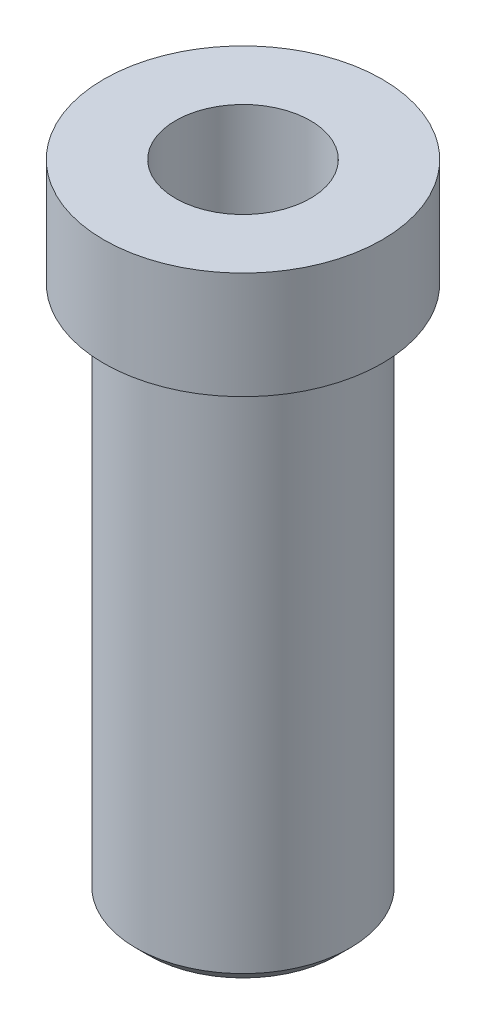
ISO-10303-21;
HEADER;
FILE_DESCRIPTION(('STEP AP214'),'2;1');
FILE_NAME('part.step','',(''),(''),'','','');
FILE_SCHEMA(('AUTOMOTIVE_DESIGN { 1 0 10303 214 1 1 1 1 }'));
ENDSEC;
DATA;
#1=APPLICATION_CONTEXT('core data for automotive mechanical design processes');
#2=APPLICATION_PROTOCOL_DEFINITION('international standard','automotive_design',2000,#1);
#3=PRODUCT_CONTEXT('',#1,'mechanical');
#4=PRODUCT('Part','Part','',(#3));
#5=PRODUCT_RELATED_PRODUCT_CATEGORY('part','',(#4));
#6=PRODUCT_DEFINITION_FORMATION('','',#4);
#7=PRODUCT_DEFINITION_CONTEXT('part definition',#1,'design');
#8=PRODUCT_DEFINITION('design','',#6,#7);
#9=PRODUCT_DEFINITION_SHAPE('','',#8);
#10=(LENGTH_UNIT() NAMED_UNIT(*) SI_UNIT(.MILLI.,.METRE.));
#11=(NAMED_UNIT(*) PLANE_ANGLE_UNIT() SI_UNIT($,.RADIAN.));
#12=(NAMED_UNIT(*) SI_UNIT($,.STERADIAN.) SOLID_ANGLE_UNIT());
#13=UNCERTAINTY_MEASURE_WITH_UNIT(LENGTH_MEASURE(1.E-05),#10,'distance_accuracy_value','');
#14=(GEOMETRIC_REPRESENTATION_CONTEXT(3) GLOBAL_UNCERTAINTY_ASSIGNED_CONTEXT((#13)) GLOBAL_UNIT_ASSIGNED_CONTEXT((#10,
#11,#12)) REPRESENTATION_CONTEXT('',''));
#15=CARTESIAN_POINT('',(0.,0.,0.));
#16=DIRECTION('',(0.,0.,1.));
#17=DIRECTION('',(1.,0.,0.));
#18=AXIS2_PLACEMENT_3D('',#15,#16,#17);
#19=CARTESIAN_POINT('',(0.5,0.,0.));
#20=DIRECTION('',(0.,-1.,0.));
#21=DIRECTION('',(0.,0.,-1.));
#22=AXIS2_PLACEMENT_3D('',#19,#20,#21);
#23=PLANE('',#22);
#24=CARTESIAN_POINT('',(0.,0.,0.));
#25=DIRECTION('',(0.,-1.,0.));
#26=DIRECTION('',(0.,0.,-1.));
#27=AXIS2_PLACEMENT_3D('',#24,#25,#26);
#28=CIRCLE('',#27,0.44);
#29=CARTESIAN_POINT('',(0.,0.,-0.44));
#30=VERTEX_POINT('',#29);
#31=EDGE_CURVE('E43',#30,#30,#28,.T.);
#32=ORIENTED_EDGE('',*,*,#31,.T.);
#33=EDGE_LOOP('',(#32));
#34=FACE_BOUND('',#33,.T.);
#35=CARTESIAN_POINT('',(0.,0.,0.));
#36=DIRECTION('',(0.,1.,0.));
#37=DIRECTION('',(0.,0.,1.));
#38=AXIS2_PLACEMENT_3D('',#35,#36,#37);
#39=CIRCLE('',#38,0.315);
#40=CARTESIAN_POINT('',(0.,0.,0.315));
#41=VERTEX_POINT('',#40);
#42=EDGE_CURVE('E59',#41,#41,#39,.T.);
#43=ORIENTED_EDGE('',*,*,#42,.T.);
#44=EDGE_LOOP('',(#43));
#45=FACE_BOUND('',#44,.T.);
#46=ADVANCED_FACE('F35',(#34,#45),#23,.T.);
#47=CARTESIAN_POINT('',(0.,3.,0.));
#48=DIRECTION('',(0.,1.,0.));
#49=DIRECTION('',(0.,0.,1.));
#50=AXIS2_PLACEMENT_3D('',#47,#48,#49);
#51=PLANE('',#50);
#52=CARTESIAN_POINT('',(0.,3.,0.));
#53=DIRECTION('',(0.,1.,0.));
#54=DIRECTION('',(0.,0.,1.));
#55=AXIS2_PLACEMENT_3D('',#52,#53,#54);
#56=CIRCLE('',#55,0.315);
#57=CARTESIAN_POINT('',(0.,3.,0.315));
#58=VERTEX_POINT('',#57);
#59=EDGE_CURVE('E60',#58,#58,#56,.T.);
#60=ORIENTED_EDGE('',*,*,#59,.F.);
#61=EDGE_LOOP('',(#60));
#62=FACE_BOUND('',#61,.T.);
#63=CARTESIAN_POINT('',(0.,3.,0.));
#64=DIRECTION('',(0.,-1.,0.));
#65=DIRECTION('',(0.,0.,-1.));
#66=AXIS2_PLACEMENT_3D('',#63,#64,#65);
#67=CIRCLE('',#66,0.65);
#68=CARTESIAN_POINT('',(0.,3.,-0.65));
#69=VERTEX_POINT('',#68);
#70=EDGE_CURVE('E47',#69,#69,#67,.T.);
#71=ORIENTED_EDGE('',*,*,#70,.F.);
#72=EDGE_LOOP('',(#71));
#73=FACE_BOUND('',#72,.T.);
#74=ADVANCED_FACE('F74',(#62,#73),#51,.T.);
#75=CARTESIAN_POINT('',(0.,0.,0.));
#76=DIRECTION('',(0.,-1.,0.));
#77=DIRECTION('',(0.,0.,-1.));
#78=AXIS2_PLACEMENT_3D('',#75,#76,#77);
#79=CYLINDRICAL_SURFACE('',#78,0.65);
#80=ORIENTED_EDGE('',*,*,#70,.T.);
#81=EDGE_LOOP('',(#80));
#82=FACE_BOUND('',#81,.T.);
#83=CARTESIAN_POINT('',(0.,2.5,0.));
#84=DIRECTION('',(0.,-1.,0.));
#85=DIRECTION('',(0.,0.,-1.));
#86=AXIS2_PLACEMENT_3D('',#83,#84,#85);
#87=CIRCLE('',#86,0.65);
#88=CARTESIAN_POINT('',(0.,2.5,-0.65));
#89=VERTEX_POINT('',#88);
#90=EDGE_CURVE('E51',#89,#89,#87,.T.);
#91=ORIENTED_EDGE('',*,*,#90,.F.);
#92=EDGE_LOOP('',(#91));
#93=FACE_BOUND('',#92,.T.);
#94=ADVANCED_FACE('F77',(#82,#93),#79,.T.);
#95=CARTESIAN_POINT('',(0.65,2.5,0.));
#96=DIRECTION('',(0.,-1.,0.));
#97=DIRECTION('',(0.,0.,-1.));
#98=AXIS2_PLACEMENT_3D('',#95,#96,#97);
#99=PLANE('',#98);
#100=ORIENTED_EDGE('',*,*,#90,.T.);
#101=EDGE_LOOP('',(#100));
#102=FACE_BOUND('',#101,.T.);
#103=CARTESIAN_POINT('',(0.,2.5,0.));
#104=DIRECTION('',(0.,-1.,0.));
#105=DIRECTION('',(0.,0.,-1.));
#106=AXIS2_PLACEMENT_3D('',#103,#104,#105);
#107=CIRCLE('',#106,0.5);
#108=CARTESIAN_POINT('',(0.,2.5,-0.5));
#109=VERTEX_POINT('',#108);
#110=EDGE_CURVE('E56',#109,#109,#107,.T.);
#111=ORIENTED_EDGE('',*,*,#110,.F.);
#112=EDGE_LOOP('',(#111));
#113=FACE_BOUND('',#112,.T.);
#114=ADVANCED_FACE('F83',(#102,#113),#99,.T.);
#115=CARTESIAN_POINT('',(0.,0.,0.));
#116=DIRECTION('',(0.,-1.,0.));
#117=DIRECTION('',(0.,0.,-1.));
#118=AXIS2_PLACEMENT_3D('',#115,#116,#117);
#119=CYLINDRICAL_SURFACE('',#118,0.5);
#120=CARTESIAN_POINT('',(0.,0.0599999999999996,0.));
#121=DIRECTION('',(0.,-1.,0.));
#122=DIRECTION('',(0.,0.,-1.));
#123=AXIS2_PLACEMENT_3D('',#120,#121,#122);
#124=CIRCLE('',#123,0.5);
#125=CARTESIAN_POINT('',(0.,0.0599999999999996,-0.5));
#126=VERTEX_POINT('',#125);
#127=EDGE_CURVE('E10',#126,#126,#124,.F.);
#128=ORIENTED_EDGE('',*,*,#127,.T.);
#129=EDGE_LOOP('',(#128));
#130=FACE_BOUND('',#129,.T.);
#131=ORIENTED_EDGE('',*,*,#110,.T.);
#132=EDGE_LOOP('',(#131));
#133=FACE_BOUND('',#132,.T.);
#134=ADVANCED_FACE('F70',(#130,#133),#119,.T.);
#135=CARTESIAN_POINT('',(0.,0.,0.));
#136=DIRECTION('',(0.,1.,0.));
#137=DIRECTION('',(0.,0.,1.));
#138=AXIS2_PLACEMENT_3D('',#135,#136,#137);
#139=CYLINDRICAL_SURFACE('',#138,0.315);
#140=ORIENTED_EDGE('',*,*,#42,.F.);
#141=EDGE_LOOP('',(#140));
#142=FACE_BOUND('',#141,.T.);
#143=ORIENTED_EDGE('',*,*,#59,.T.);
#144=EDGE_LOOP('',(#143));
#145=FACE_BOUND('',#144,.T.);
#146=ADVANCED_FACE('F67',(#142,#145),#139,.F.);
#147=CARTESIAN_POINT('',(0.,0.,0.));
#148=DIRECTION('',(0.,1.,0.));
#149=DIRECTION('',(0.,0.,1.));
#150=AXIS2_PLACEMENT_3D('',#147,#148,#149);
#151=CONICAL_SURFACE('',#150,0.44,0.785398163397447);
#152=ORIENTED_EDGE('',*,*,#127,.F.);
#153=EDGE_LOOP('',(#152));
#154=FACE_BOUND('',#153,.T.);
#155=ORIENTED_EDGE('',*,*,#31,.F.);
#156=EDGE_LOOP('',(#155));
#157=FACE_BOUND('',#156,.T.);
#158=ADVANCED_FACE('F38',(#154,#157),#151,.T.);
#159=CLOSED_SHELL('',(#46,#74,#94,#114,#134,#146,#158));
#160=MANIFOLD_SOLID_BREP('B2',#159);
#161=ADVANCED_BREP_SHAPE_REPRESENTATION('',(#18,#160),#14);
#162=SHAPE_DEFINITION_REPRESENTATION(#9,#161);
ENDSEC;
END-ISO-10303-21;
